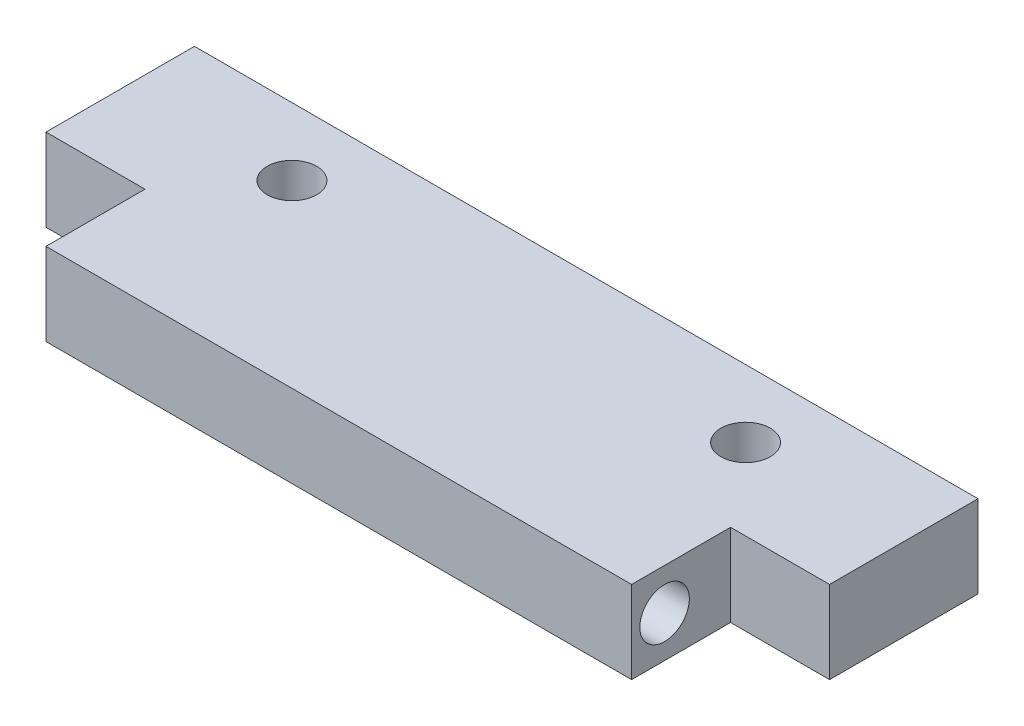
ISO-10303-21;
HEADER;
FILE_DESCRIPTION(('STEP AP214'),'2;1');
FILE_NAME('part.step','',(''),(''),'','','');
FILE_SCHEMA(('AUTOMOTIVE_DESIGN { 1 0 10303 214 1 1 1 1 }'));
ENDSEC;
DATA;
#1=APPLICATION_CONTEXT('core data for automotive mechanical design processes');
#2=APPLICATION_PROTOCOL_DEFINITION('international standard','automotive_design',2000,#1);
#3=PRODUCT_CONTEXT('',#1,'mechanical');
#4=PRODUCT('Part','Part','',(#3));
#5=PRODUCT_RELATED_PRODUCT_CATEGORY('part','',(#4));
#6=PRODUCT_DEFINITION_FORMATION('','',#4);
#7=PRODUCT_DEFINITION_CONTEXT('part definition',#1,'design');
#8=PRODUCT_DEFINITION('design','',#6,#7);
#9=PRODUCT_DEFINITION_SHAPE('','',#8);
#10=(LENGTH_UNIT() NAMED_UNIT(*) SI_UNIT(.MILLI.,.METRE.));
#11=(NAMED_UNIT(*) PLANE_ANGLE_UNIT() SI_UNIT($,.RADIAN.));
#12=(NAMED_UNIT(*) SI_UNIT($,.STERADIAN.) SOLID_ANGLE_UNIT());
#13=UNCERTAINTY_MEASURE_WITH_UNIT(LENGTH_MEASURE(1.E-05),#10,'distance_accuracy_value','');
#14=(GEOMETRIC_REPRESENTATION_CONTEXT(3) GLOBAL_UNCERTAINTY_ASSIGNED_CONTEXT((#13)) GLOBAL_UNIT_ASSIGNED_CONTEXT((#10,
#11,#12)) REPRESENTATION_CONTEXT('',''));
#15=CARTESIAN_POINT('',(0.,0.,0.));
#16=DIRECTION('',(0.,0.,1.));
#17=DIRECTION('',(1.,0.,0.));
#18=AXIS2_PLACEMENT_3D('',#15,#16,#17);
#19=CARTESIAN_POINT('',(0.,5.,0.));
#20=DIRECTION('',(0.,1.,0.));
#21=DIRECTION('',(0.,0.,1.));
#22=AXIS2_PLACEMENT_3D('',#19,#20,#21);
#23=PLANE('',#22);
#24=CARTESIAN_POINT('',(-60.8875085304823,5.,-24.5186398139903));
#25=DIRECTION('',(0.,1.,0.));
#26=DIRECTION('',(0.,0.,1.));
#27=AXIS2_PLACEMENT_3D('',#24,#25,#26);
#28=CIRCLE('',#27,1.5);
#29=CARTESIAN_POINT('',(-60.8875085304823,5.,-23.0186398139903));
#30=VERTEX_POINT('',#29);
#31=EDGE_CURVE('E153',#30,#30,#28,.T.);
#32=ORIENTED_EDGE('',*,*,#31,.F.);
#33=EDGE_LOOP('',(#32));
#34=FACE_BOUND('',#33,.T.);
#35=DIRECTION('',(0.,0.,1.));
#36=VECTOR('',#35,1.);
#37=CARTESIAN_POINT('',(-70.8875085304823,5.,-28.608973411143));
#38=LINE('',#37,#36);
#39=CARTESIAN_POINT('',(-70.8875085304823,5.,-28.608973411143));
#40=VERTEX_POINT('',#39);
#41=CARTESIAN_POINT('',(-70.8875085304823,5.,-19.608973411143));
#42=VERTEX_POINT('',#41);
#43=EDGE_CURVE('E171',#40,#42,#38,.T.);
#44=ORIENTED_EDGE('',*,*,#43,.T.);
#45=DIRECTION('',(1.,0.,0.));
#46=VECTOR('',#45,1.);
#47=CARTESIAN_POINT('',(-70.8875085304823,5.,-19.608973411143));
#48=LINE('',#47,#46);
#49=CARTESIAN_POINT('',(-64.8875085304823,5.,-19.608973411143));
#50=VERTEX_POINT('',#49);
#51=EDGE_CURVE('E107',#42,#50,#48,.T.);
#52=ORIENTED_EDGE('',*,*,#51,.T.);
#53=DIRECTION('',(0.,0.,1.));
#54=VECTOR('',#53,1.);
#55=CARTESIAN_POINT('',(-64.8875085304823,5.,-19.608973411143));
#56=LINE('',#55,#54);
#57=CARTESIAN_POINT('',(-64.8875085304823,5.,-13.608973411143));
#58=VERTEX_POINT('',#57);
#59=EDGE_CURVE('E193',#50,#58,#56,.T.);
#60=ORIENTED_EDGE('',*,*,#59,.T.);
#61=DIRECTION('',(1.,0.,0.));
#62=VECTOR('',#61,1.);
#63=CARTESIAN_POINT('',(-64.8875085304823,5.,-13.608973411143));
#64=LINE('',#63,#62);
#65=CARTESIAN_POINT('',(-29.3875085304823,5.,-13.608973411143));
#66=VERTEX_POINT('',#65);
#67=EDGE_CURVE('E207',#58,#66,#64,.T.);
#68=ORIENTED_EDGE('',*,*,#67,.T.);
#69=DIRECTION('',(0.,0.,-1.));
#70=VECTOR('',#69,1.);
#71=CARTESIAN_POINT('',(-29.3875085304823,5.,-19.608973411143));
#72=LINE('',#71,#70);
#73=CARTESIAN_POINT('',(-29.3875085304823,5.,-19.608973411143));
#74=VERTEX_POINT('',#73);
#75=EDGE_CURVE('E126',#66,#74,#72,.T.);
#76=ORIENTED_EDGE('',*,*,#75,.T.);
#77=DIRECTION('',(1.,0.,0.));
#78=VECTOR('',#77,1.);
#79=CARTESIAN_POINT('',(-23.3875085304823,5.,-19.608973411143));
#80=LINE('',#79,#78);
#81=CARTESIAN_POINT('',(-23.3875085304823,5.,-19.608973411143));
#82=VERTEX_POINT('',#81);
#83=EDGE_CURVE('E120',#74,#82,#80,.T.);
#84=ORIENTED_EDGE('',*,*,#83,.T.);
#85=DIRECTION('',(0.,0.,-1.));
#86=VECTOR('',#85,1.);
#87=CARTESIAN_POINT('',(-23.3875085304823,5.,-28.608973411143));
#88=LINE('',#87,#86);
#89=CARTESIAN_POINT('',(-23.3875085304823,5.,-28.608973411143));
#90=VERTEX_POINT('',#89);
#91=EDGE_CURVE('E124',#82,#90,#88,.T.);
#92=ORIENTED_EDGE('',*,*,#91,.T.);
#93=DIRECTION('',(-1.,0.,0.));
#94=VECTOR('',#93,1.);
#95=CARTESIAN_POINT('',(-70.8875085304823,5.,-28.608973411143));
#96=LINE('',#95,#94);
#97=EDGE_CURVE('E64',#90,#40,#96,.T.);
#98=ORIENTED_EDGE('',*,*,#97,.T.);
#99=EDGE_LOOP('',(#44,#52,#60,#68,#76,#84,#92,#98));
#100=FACE_BOUND('',#99,.T.);
#101=CARTESIAN_POINT('',(-33.3875085304823,5.,-24.5186398139903));
#102=DIRECTION('',(0.,1.,0.));
#103=DIRECTION('',(0.,0.,1.));
#104=AXIS2_PLACEMENT_3D('',#101,#102,#103);
#105=CIRCLE('',#104,1.5);
#106=CARTESIAN_POINT('',(-33.3875085304823,5.,-23.0186398139903));
#107=VERTEX_POINT('',#106);
#108=EDGE_CURVE('E221',#107,#107,#105,.T.);
#109=ORIENTED_EDGE('',*,*,#108,.F.);
#110=EDGE_LOOP('',(#109));
#111=FACE_BOUND('',#110,.T.);
#112=ADVANCED_FACE('F45',(#34,#100,#111),#23,.T.);
#113=CARTESIAN_POINT('',(0.,0.,0.));
#114=DIRECTION('',(0.,1.,0.));
#115=DIRECTION('',(0.,0.,1.));
#116=AXIS2_PLACEMENT_3D('',#113,#114,#115);
#117=PLANE('',#116);
#118=DIRECTION('',(0.,0.,1.));
#119=VECTOR('',#118,1.);
#120=CARTESIAN_POINT('',(-70.8875085304823,0.,-28.608973411143));
#121=LINE('',#120,#119);
#122=CARTESIAN_POINT('',(-70.8875085304823,0.,-28.608973411143));
#123=VERTEX_POINT('',#122);
#124=CARTESIAN_POINT('',(-70.8875085304823,0.,-19.608973411143));
#125=VERTEX_POINT('',#124);
#126=EDGE_CURVE('E148',#123,#125,#121,.T.);
#127=ORIENTED_EDGE('',*,*,#126,.F.);
#128=DIRECTION('',(-1.,0.,0.));
#129=VECTOR('',#128,1.);
#130=CARTESIAN_POINT('',(-70.8875085304823,0.,-28.608973411143));
#131=LINE('',#130,#129);
#132=CARTESIAN_POINT('',(-23.3875085304823,0.,-28.608973411143));
#133=VERTEX_POINT('',#132);
#134=EDGE_CURVE('E99',#133,#123,#131,.T.);
#135=ORIENTED_EDGE('',*,*,#134,.F.);
#136=DIRECTION('',(0.,0.,-1.));
#137=VECTOR('',#136,1.);
#138=CARTESIAN_POINT('',(-23.3875085304823,0.,-28.608973411143));
#139=LINE('',#138,#137);
#140=CARTESIAN_POINT('',(-23.3875085304823,0.,-19.608973411143));
#141=VERTEX_POINT('',#140);
#142=EDGE_CURVE('E93',#141,#133,#139,.T.);
#143=ORIENTED_EDGE('',*,*,#142,.F.);
#144=DIRECTION('',(1.,0.,0.));
#145=VECTOR('',#144,1.);
#146=CARTESIAN_POINT('',(-23.3875085304823,0.,-19.608973411143));
#147=LINE('',#146,#145);
#148=CARTESIAN_POINT('',(-29.3875085304823,0.,-19.608973411143));
#149=VERTEX_POINT('',#148);
#150=EDGE_CURVE('E135',#149,#141,#147,.T.);
#151=ORIENTED_EDGE('',*,*,#150,.F.);
#152=DIRECTION('',(0.,0.,-1.));
#153=VECTOR('',#152,1.);
#154=CARTESIAN_POINT('',(-29.3875085304823,0.,-19.608973411143));
#155=LINE('',#154,#153);
#156=CARTESIAN_POINT('',(-29.3875085304823,0.,-13.608973411143));
#157=VERTEX_POINT('',#156);
#158=EDGE_CURVE('E162',#157,#149,#155,.T.);
#159=ORIENTED_EDGE('',*,*,#158,.F.);
#160=DIRECTION('',(1.,0.,0.));
#161=VECTOR('',#160,1.);
#162=CARTESIAN_POINT('',(-64.8875085304823,0.,-13.608973411143));
#163=LINE('',#162,#161);
#164=CARTESIAN_POINT('',(-64.8875085304823,0.,-13.608973411143));
#165=VERTEX_POINT('',#164);
#166=EDGE_CURVE('E159',#165,#157,#163,.T.);
#167=ORIENTED_EDGE('',*,*,#166,.F.);
#168=DIRECTION('',(0.,0.,1.));
#169=VECTOR('',#168,1.);
#170=CARTESIAN_POINT('',(-64.8875085304823,0.,-19.608973411143));
#171=LINE('',#170,#169);
#172=CARTESIAN_POINT('',(-64.8875085304823,0.,-19.608973411143));
#173=VERTEX_POINT('',#172);
#174=EDGE_CURVE('E156',#173,#165,#171,.T.);
#175=ORIENTED_EDGE('',*,*,#174,.F.);
#176=DIRECTION('',(1.,0.,0.));
#177=VECTOR('',#176,1.);
#178=CARTESIAN_POINT('',(-70.8875085304823,0.,-19.608973411143));
#179=LINE('',#178,#177);
#180=EDGE_CURVE('E152',#125,#173,#179,.T.);
#181=ORIENTED_EDGE('',*,*,#180,.F.);
#182=EDGE_LOOP('',(#127,#135,#143,#151,#159,#167,#175,#181));
#183=FACE_BOUND('',#182,.T.);
#184=CARTESIAN_POINT('',(-60.8875085304823,0.,-24.5186398139903));
#185=DIRECTION('',(0.,1.,0.));
#186=DIRECTION('',(0.,0.,1.));
#187=AXIS2_PLACEMENT_3D('',#184,#185,#186);
#188=CIRCLE('',#187,1.5);
#189=CARTESIAN_POINT('',(-60.8875085304823,0.,-23.0186398139903));
#190=VERTEX_POINT('',#189);
#191=EDGE_CURVE('E217',#190,#190,#188,.T.);
#192=ORIENTED_EDGE('',*,*,#191,.T.);
#193=EDGE_LOOP('',(#192));
#194=FACE_BOUND('',#193,.T.);
#195=CARTESIAN_POINT('',(-33.3875085304823,0.,-24.5186398139903));
#196=DIRECTION('',(0.,1.,0.));
#197=DIRECTION('',(0.,0.,1.));
#198=AXIS2_PLACEMENT_3D('',#195,#196,#197);
#199=CIRCLE('',#198,1.5);
#200=CARTESIAN_POINT('',(-33.3875085304823,0.,-23.0186398139903));
#201=VERTEX_POINT('',#200);
#202=EDGE_CURVE('E225',#201,#201,#199,.T.);
#203=ORIENTED_EDGE('',*,*,#202,.T.);
#204=EDGE_LOOP('',(#203));
#205=FACE_BOUND('',#204,.T.);
#206=ADVANCED_FACE('F197',(#183,#194,#205),#117,.F.);
#207=CARTESIAN_POINT('',(-70.8875085304823,5.,-28.608973411143));
#208=DIRECTION('',(1.,0.,0.));
#209=DIRECTION('',(0.,0.,-1.));
#210=AXIS2_PLACEMENT_3D('',#207,#208,#209);
#211=PLANE('',#210);
#212=ORIENTED_EDGE('',*,*,#126,.T.);
#213=DIRECTION('',(0.,-1.,0.));
#214=VECTOR('',#213,1.);
#215=CARTESIAN_POINT('',(-70.8875085304823,5.,-19.608973411143));
#216=LINE('',#215,#214);
#217=EDGE_CURVE('E11',#42,#125,#216,.T.);
#218=ORIENTED_EDGE('',*,*,#217,.F.);
#219=ORIENTED_EDGE('',*,*,#43,.F.);
#220=DIRECTION('',(0.,-1.,0.));
#221=VECTOR('',#220,1.);
#222=CARTESIAN_POINT('',(-70.8875085304823,5.,-28.608973411143));
#223=LINE('',#222,#221);
#224=EDGE_CURVE('E144',#40,#123,#223,.T.);
#225=ORIENTED_EDGE('',*,*,#224,.T.);
#226=EDGE_LOOP('',(#212,#218,#219,#225));
#227=FACE_BOUND('',#226,.T.);
#228=ADVANCED_FACE('F47',(#227),#211,.F.);
#229=CARTESIAN_POINT('',(-70.8875085304823,5.,-19.608973411143));
#230=DIRECTION('',(0.,0.,-1.));
#231=DIRECTION('',(-1.,0.,0.));
#232=AXIS2_PLACEMENT_3D('',#229,#230,#231);
#233=PLANE('',#232);
#234=ORIENTED_EDGE('',*,*,#180,.T.);
#235=DIRECTION('',(0.,-1.,0.));
#236=VECTOR('',#235,1.);
#237=CARTESIAN_POINT('',(-64.8875085304823,5.,-19.608973411143));
#238=LINE('',#237,#236);
#239=EDGE_CURVE('E56',#50,#173,#238,.T.);
#240=ORIENTED_EDGE('',*,*,#239,.F.);
#241=ORIENTED_EDGE('',*,*,#51,.F.);
#242=ORIENTED_EDGE('',*,*,#217,.T.);
#243=EDGE_LOOP('',(#234,#240,#241,#242));
#244=FACE_BOUND('',#243,.T.);
#245=ADVANCED_FACE('F274',(#244),#233,.F.);
#246=CARTESIAN_POINT('',(-64.8875085304823,5.,-19.608973411143));
#247=DIRECTION('',(1.,0.,0.));
#248=DIRECTION('',(0.,0.,-1.));
#249=AXIS2_PLACEMENT_3D('',#246,#247,#248);
#250=PLANE('',#249);
#251=CARTESIAN_POINT('',(-64.8875085304823,2.5,-15.608973411143));
#252=DIRECTION('',(-1.,0.,0.));
#253=DIRECTION('',(0.,0.,1.));
#254=AXIS2_PLACEMENT_3D('',#251,#252,#253);
#255=CIRCLE('',#254,1.5);
#256=CARTESIAN_POINT('',(-64.8875085304823,2.5,-14.108973411143));
#257=VERTEX_POINT('',#256);
#258=EDGE_CURVE('E232',#257,#257,#255,.T.);
#259=ORIENTED_EDGE('',*,*,#258,.F.);
#260=EDGE_LOOP('',(#259));
#261=FACE_BOUND('',#260,.T.);
#262=ORIENTED_EDGE('',*,*,#174,.T.);
#263=DIRECTION('',(0.,-1.,0.));
#264=VECTOR('',#263,1.);
#265=CARTESIAN_POINT('',(-64.8875085304823,5.,-13.608973411143));
#266=LINE('',#265,#264);
#267=EDGE_CURVE('E182',#58,#165,#266,.T.);
#268=ORIENTED_EDGE('',*,*,#267,.F.);
#269=ORIENTED_EDGE('',*,*,#59,.F.);
#270=ORIENTED_EDGE('',*,*,#239,.T.);
#271=EDGE_LOOP('',(#262,#268,#269,#270));
#272=FACE_BOUND('',#271,.T.);
#273=ADVANCED_FACE('F191',(#261,#272),#250,.F.);
#274=CARTESIAN_POINT('',(-64.8875085304823,5.,-13.608973411143));
#275=DIRECTION('',(0.,0.,-1.));
#276=DIRECTION('',(-1.,0.,0.));
#277=AXIS2_PLACEMENT_3D('',#274,#275,#276);
#278=PLANE('',#277);
#279=ORIENTED_EDGE('',*,*,#166,.T.);
#280=DIRECTION('',(0.,-1.,0.));
#281=VECTOR('',#280,1.);
#282=CARTESIAN_POINT('',(-29.3875085304823,5.,-13.608973411143));
#283=LINE('',#282,#281);
#284=EDGE_CURVE('E178',#66,#157,#283,.T.);
#285=ORIENTED_EDGE('',*,*,#284,.F.);
#286=ORIENTED_EDGE('',*,*,#67,.F.);
#287=ORIENTED_EDGE('',*,*,#267,.T.);
#288=EDGE_LOOP('',(#279,#285,#286,#287));
#289=FACE_BOUND('',#288,.T.);
#290=ADVANCED_FACE('F202',(#289),#278,.F.);
#291=CARTESIAN_POINT('',(-29.3875085304823,5.,-19.608973411143));
#292=DIRECTION('',(-1.,0.,0.));
#293=DIRECTION('',(0.,0.,1.));
#294=AXIS2_PLACEMENT_3D('',#291,#292,#293);
#295=PLANE('',#294);
#296=CARTESIAN_POINT('',(-29.3875085304823,2.5,-15.608973411143));
#297=DIRECTION('',(-1.,0.,0.));
#298=DIRECTION('',(0.,0.,1.));
#299=AXIS2_PLACEMENT_3D('',#296,#297,#298);
#300=CIRCLE('',#299,1.5);
#301=CARTESIAN_POINT('',(-29.3875085304823,2.5,-14.108973411143));
#302=VERTEX_POINT('',#301);
#303=EDGE_CURVE('E49',#302,#302,#300,.T.);
#304=ORIENTED_EDGE('',*,*,#303,.T.);
#305=EDGE_LOOP('',(#304));
#306=FACE_BOUND('',#305,.T.);
#307=ORIENTED_EDGE('',*,*,#158,.T.);
#308=DIRECTION('',(0.,-1.,0.));
#309=VECTOR('',#308,1.);
#310=CARTESIAN_POINT('',(-29.3875085304823,5.,-19.608973411143));
#311=LINE('',#310,#309);
#312=EDGE_CURVE('E137',#74,#149,#311,.T.);
#313=ORIENTED_EDGE('',*,*,#312,.F.);
#314=ORIENTED_EDGE('',*,*,#75,.F.);
#315=ORIENTED_EDGE('',*,*,#284,.T.);
#316=EDGE_LOOP('',(#307,#313,#314,#315));
#317=FACE_BOUND('',#316,.T.);
#318=ADVANCED_FACE('F205',(#306,#317),#295,.F.);
#319=CARTESIAN_POINT('',(-23.3875085304823,5.,-19.608973411143));
#320=DIRECTION('',(0.,0.,-1.));
#321=DIRECTION('',(-1.,0.,0.));
#322=AXIS2_PLACEMENT_3D('',#319,#320,#321);
#323=PLANE('',#322);
#324=ORIENTED_EDGE('',*,*,#150,.T.);
#325=DIRECTION('',(0.,-1.,0.));
#326=VECTOR('',#325,1.);
#327=CARTESIAN_POINT('',(-23.3875085304823,5.,-19.608973411143));
#328=LINE('',#327,#326);
#329=EDGE_CURVE('E132',#82,#141,#328,.T.);
#330=ORIENTED_EDGE('',*,*,#329,.F.);
#331=ORIENTED_EDGE('',*,*,#83,.F.);
#332=ORIENTED_EDGE('',*,*,#312,.T.);
#333=EDGE_LOOP('',(#324,#330,#331,#332));
#334=FACE_BOUND('',#333,.T.);
#335=ADVANCED_FACE('F133',(#334),#323,.F.);
#336=CARTESIAN_POINT('',(-23.3875085304823,5.,-28.608973411143));
#337=DIRECTION('',(-1.,0.,0.));
#338=DIRECTION('',(0.,0.,1.));
#339=AXIS2_PLACEMENT_3D('',#336,#337,#338);
#340=PLANE('',#339);
#341=ORIENTED_EDGE('',*,*,#142,.T.);
#342=DIRECTION('',(0.,-1.,0.));
#343=VECTOR('',#342,1.);
#344=CARTESIAN_POINT('',(-23.3875085304823,5.,-28.608973411143));
#345=LINE('',#344,#343);
#346=EDGE_CURVE('E138',#90,#133,#345,.T.);
#347=ORIENTED_EDGE('',*,*,#346,.F.);
#348=ORIENTED_EDGE('',*,*,#91,.F.);
#349=ORIENTED_EDGE('',*,*,#329,.T.);
#350=EDGE_LOOP('',(#341,#347,#348,#349));
#351=FACE_BOUND('',#350,.T.);
#352=ADVANCED_FACE('F140',(#351),#340,.F.);
#353=CARTESIAN_POINT('',(-70.8875085304823,5.,-28.608973411143));
#354=DIRECTION('',(0.,0.,1.));
#355=DIRECTION('',(1.,0.,0.));
#356=AXIS2_PLACEMENT_3D('',#353,#354,#355);
#357=PLANE('',#356);
#358=ORIENTED_EDGE('',*,*,#134,.T.);
#359=ORIENTED_EDGE('',*,*,#224,.F.);
#360=ORIENTED_EDGE('',*,*,#97,.F.);
#361=ORIENTED_EDGE('',*,*,#346,.T.);
#362=EDGE_LOOP('',(#358,#359,#360,#361));
#363=FACE_BOUND('',#362,.T.);
#364=ADVANCED_FACE('F263',(#363),#357,.F.);
#365=CARTESIAN_POINT('',(-60.8875085304823,5.,-24.5186398139903));
#366=DIRECTION('',(0.,-1.,0.));
#367=DIRECTION('',(0.,0.,-1.));
#368=AXIS2_PLACEMENT_3D('',#365,#366,#367);
#369=CYLINDRICAL_SURFACE('',#368,1.5);
#370=ORIENTED_EDGE('',*,*,#31,.T.);
#371=EDGE_LOOP('',(#370));
#372=FACE_BOUND('',#371,.T.);
#373=ORIENTED_EDGE('',*,*,#191,.F.);
#374=EDGE_LOOP('',(#373));
#375=FACE_BOUND('',#374,.T.);
#376=ADVANCED_FACE('F250',(#372,#375),#369,.F.);
#377=CARTESIAN_POINT('',(-33.3875085304823,5.,-24.5186398139903));
#378=DIRECTION('',(0.,-1.,0.));
#379=DIRECTION('',(0.,0.,-1.));
#380=AXIS2_PLACEMENT_3D('',#377,#378,#379);
#381=CYLINDRICAL_SURFACE('',#380,1.5);
#382=ORIENTED_EDGE('',*,*,#108,.T.);
#383=EDGE_LOOP('',(#382));
#384=FACE_BOUND('',#383,.T.);
#385=ORIENTED_EDGE('',*,*,#202,.F.);
#386=EDGE_LOOP('',(#385));
#387=FACE_BOUND('',#386,.T.);
#388=ADVANCED_FACE('F244',(#384,#387),#381,.F.);
#389=CARTESIAN_POINT('',(-23.3875085304823,2.5,-15.608973411143));
#390=DIRECTION('',(-1.,0.,0.));
#391=DIRECTION('',(0.,0.,1.));
#392=AXIS2_PLACEMENT_3D('',#389,#390,#391);
#393=CYLINDRICAL_SURFACE('',#392,1.5);
#394=CARTESIAN_POINT('',(-64.8875085304823,2.5,-14.108973411143));
#395=CARTESIAN_POINT('',(-64.5177168638156,2.5,-14.108973411143));
#396=CARTESIAN_POINT('',(-64.1479251971489,2.5,-14.108973411143));
#397=CARTESIAN_POINT('',(-63.4083418638156,2.5,-14.108973411143));
#398=CARTESIAN_POINT('',(-63.0385501971489,2.5,-14.108973411143));
#399=CARTESIAN_POINT('',(-62.2989668638156,2.5,-14.108973411143));
#400=CARTESIAN_POINT('',(-61.9291751971489,2.5,-14.108973411143));
#401=CARTESIAN_POINT('',(-61.1895918638156,2.5,-14.108973411143));
#402=CARTESIAN_POINT('',(-60.8198001971489,2.5,-14.108973411143));
#403=CARTESIAN_POINT('',(-60.0802168638156,2.5,-14.108973411143));
#404=CARTESIAN_POINT('',(-59.7104251971489,2.5,-14.108973411143));
#405=CARTESIAN_POINT('',(-58.9708418638156,2.5,-14.108973411143));
#406=CARTESIAN_POINT('',(-58.6010501971489,2.5,-14.108973411143));
#407=CARTESIAN_POINT('',(-57.8614668638156,2.5,-14.108973411143));
#408=CARTESIAN_POINT('',(-57.4916751971489,2.5,-14.108973411143));
#409=CARTESIAN_POINT('',(-56.7520918638156,2.5,-14.108973411143));
#410=CARTESIAN_POINT('',(-56.3823001971489,2.5,-14.108973411143));
#411=CARTESIAN_POINT('',(-55.6427168638156,2.5,-14.108973411143));
#412=CARTESIAN_POINT('',(-55.2729251971489,2.5,-14.108973411143));
#413=CARTESIAN_POINT('',(-54.5333418638156,2.5,-14.108973411143));
#414=CARTESIAN_POINT('',(-54.1635501971489,2.5,-14.108973411143));
#415=CARTESIAN_POINT('',(-53.4239668638156,2.5,-14.108973411143));
#416=CARTESIAN_POINT('',(-53.0541751971489,2.5,-14.108973411143));
#417=CARTESIAN_POINT('',(-52.3145918638156,2.5,-14.108973411143));
#418=CARTESIAN_POINT('',(-51.9448001971489,2.5,-14.108973411143));
#419=CARTESIAN_POINT('',(-51.2052168638156,2.5,-14.108973411143));
#420=CARTESIAN_POINT('',(-50.8354251971489,2.5,-14.108973411143));
#421=CARTESIAN_POINT('',(-50.0958418638156,2.5,-14.108973411143));
#422=CARTESIAN_POINT('',(-49.7260501971489,2.5,-14.108973411143));
#423=CARTESIAN_POINT('',(-48.9864668638156,2.5,-14.108973411143));
#424=CARTESIAN_POINT('',(-48.6166751971489,2.5,-14.108973411143));
#425=CARTESIAN_POINT('',(-47.8770918638156,2.5,-14.108973411143));
#426=CARTESIAN_POINT('',(-47.5073001971489,2.5,-14.108973411143));
#427=CARTESIAN_POINT('',(-46.7677168638156,2.5,-14.108973411143));
#428=CARTESIAN_POINT('',(-46.3979251971489,2.5,-14.108973411143));
#429=CARTESIAN_POINT('',(-45.6583418638156,2.5,-14.108973411143));
#430=CARTESIAN_POINT('',(-45.2885501971489,2.5,-14.108973411143));
#431=CARTESIAN_POINT('',(-44.5489668638156,2.5,-14.108973411143));
#432=CARTESIAN_POINT('',(-44.1791751971489,2.5,-14.108973411143));
#433=CARTESIAN_POINT('',(-43.4395918638156,2.5,-14.108973411143));
#434=CARTESIAN_POINT('',(-43.0698001971489,2.5,-14.108973411143));
#435=CARTESIAN_POINT('',(-42.3302168638156,2.5,-14.108973411143));
#436=CARTESIAN_POINT('',(-41.9604251971489,2.5,-14.108973411143));
#437=CARTESIAN_POINT('',(-41.2208418638156,2.5,-14.108973411143));
#438=CARTESIAN_POINT('',(-40.8510501971489,2.5,-14.108973411143));
#439=CARTESIAN_POINT('',(-40.1114668638156,2.5,-14.108973411143));
#440=CARTESIAN_POINT('',(-39.7416751971489,2.5,-14.108973411143));
#441=CARTESIAN_POINT('',(-39.0020918638156,2.5,-14.108973411143));
#442=CARTESIAN_POINT('',(-38.6323001971489,2.5,-14.108973411143));
#443=CARTESIAN_POINT('',(-37.8927168638156,2.5,-14.108973411143));
#444=CARTESIAN_POINT('',(-37.5229251971489,2.5,-14.108973411143));
#445=CARTESIAN_POINT('',(-36.7833418638156,2.5,-14.108973411143));
#446=CARTESIAN_POINT('',(-36.4135501971489,2.5,-14.108973411143));
#447=CARTESIAN_POINT('',(-35.6739668638156,2.5,-14.108973411143));
#448=CARTESIAN_POINT('',(-35.3041751971489,2.5,-14.108973411143));
#449=CARTESIAN_POINT('',(-34.5645918638156,2.5,-14.108973411143));
#450=CARTESIAN_POINT('',(-34.1948001971489,2.5,-14.108973411143));
#451=CARTESIAN_POINT('',(-33.4552168638156,2.5,-14.108973411143));
#452=CARTESIAN_POINT('',(-33.0854251971489,2.5,-14.108973411143));
#453=CARTESIAN_POINT('',(-32.3458418638156,2.5,-14.108973411143));
#454=CARTESIAN_POINT('',(-31.9760501971489,2.5,-14.108973411143));
#455=CARTESIAN_POINT('',(-31.2364668638156,2.5,-14.108973411143));
#456=CARTESIAN_POINT('',(-30.8666751971489,2.5,-14.108973411143));
#457=CARTESIAN_POINT('',(-30.1270918638156,2.5,-14.108973411143));
#458=CARTESIAN_POINT('',(-29.7573001971489,2.5,-14.108973411143));
#459=CARTESIAN_POINT('',(-29.3875085304823,2.5,-14.108973411143));
#460=B_SPLINE_CURVE_WITH_KNOTS('',3,(#394,#395,#396,#397,#398,#399,#400,#401,#402,#403,#404,
#405,#406,#407,#408,#409,#410,#411,#412,#413,#414,#415,#416,#417,#418,#419,#420,#421,#422,#423,
#424,#425,#426,#427,#428,#429,#430,#431,#432,#433,#434,#435,#436,#437,#438,#439,#440,#441,#442,
#443,#444,#445,#446,#447,#448,#449,#450,#451,#452,#453,#454,#455,#456,#457,#458,#459),
.UNSPECIFIED.,.F.,.F.,(4,2,2,2,2,2,2,2,2,2,2,2,2,2,2,2,2,2,2,2,2,2,2,2,2,2,2,2,2,2,2,2,4),(0.,
1.10937500000001,2.21875000000001,3.32812500000001,4.4375,5.54687500000001,6.65625,
7.76562500000001,8.875,9.984375,11.09375,12.203125,13.3125,14.421875,15.53125,16.640625,17.75,
18.859375,19.96875,21.078125,22.1875,23.296875,24.40625,25.515625,26.625,27.734375,28.84375,
29.953125,31.0625,32.171875,33.28125,34.390625,35.5),.UNSPECIFIED.);
#461=EDGE_CURVE('BSEAM242',#257,#302,#460,.T.);
#462=ORIENTED_EDGE('',*,*,#258,.T.);
#463=ORIENTED_EDGE('',*,*,#303,.F.);
#464=ORIENTED_EDGE('',*,*,#461,.T.);
#465=ORIENTED_EDGE('',*,*,#461,.F.);
#466=EDGE_LOOP('',(#462,#464,#463,#465));
#467=FACE_BOUND('',#466,.T.);
#468=ADVANCED_FACE('F242',(#467),#393,.F.);
#469=CLOSED_SHELL('',(#112,#206,#228,#245,#273,#290,#318,#335,#352,#364,#376,#388,#468));
#470=MANIFOLD_SOLID_BREP('B2',#469);
#471=ADVANCED_BREP_SHAPE_REPRESENTATION('',(#18,#470),#14);
#472=SHAPE_DEFINITION_REPRESENTATION(#9,#471);
ENDSEC;
END-ISO-10303-21;
